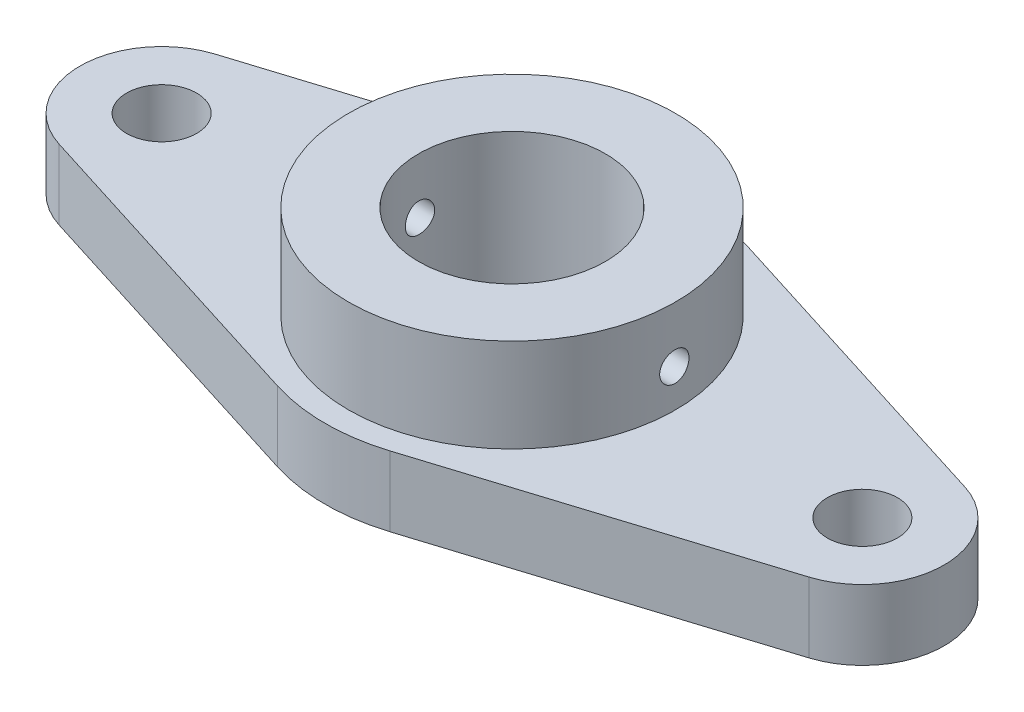
ISO-10303-21;
HEADER;
FILE_DESCRIPTION(('STEP AP214'),'2;1');
FILE_NAME('part.step','',(''),(''),'','','');
FILE_SCHEMA(('AUTOMOTIVE_DESIGN { 1 0 10303 214 1 1 1 1 }'));
ENDSEC;
DATA;
#1=APPLICATION_CONTEXT('core data for automotive mechanical design processes');
#2=APPLICATION_PROTOCOL_DEFINITION('international standard','automotive_design',2000,#1);
#3=PRODUCT_CONTEXT('',#1,'mechanical');
#4=PRODUCT('Part','Part','',(#3));
#5=PRODUCT_RELATED_PRODUCT_CATEGORY('part','',(#4));
#6=PRODUCT_DEFINITION_FORMATION('','',#4);
#7=PRODUCT_DEFINITION_CONTEXT('part definition',#1,'design');
#8=PRODUCT_DEFINITION('design','',#6,#7);
#9=PRODUCT_DEFINITION_SHAPE('','',#8);
#10=(LENGTH_UNIT() NAMED_UNIT(*) SI_UNIT(.MILLI.,.METRE.));
#11=(NAMED_UNIT(*) PLANE_ANGLE_UNIT() SI_UNIT($,.RADIAN.));
#12=(NAMED_UNIT(*) SI_UNIT($,.STERADIAN.) SOLID_ANGLE_UNIT());
#13=UNCERTAINTY_MEASURE_WITH_UNIT(LENGTH_MEASURE(1.E-05),#10,'distance_accuracy_value','');
#14=(GEOMETRIC_REPRESENTATION_CONTEXT(3) GLOBAL_UNCERTAINTY_ASSIGNED_CONTEXT((#13)) GLOBAL_UNIT_ASSIGNED_CONTEXT((#10,
#11,#12)) REPRESENTATION_CONTEXT('',''));
#15=CARTESIAN_POINT('',(0.,0.,0.));
#16=DIRECTION('',(0.,0.,1.));
#17=DIRECTION('',(1.,0.,0.));
#18=AXIS2_PLACEMENT_3D('',#15,#16,#17);
#19=CARTESIAN_POINT('',(2.4,3.,-7.63151361133556));
#20=DIRECTION('',(0.3,0.,-0.953939201416946));
#21=DIRECTION('',(-0.953939201416946,0.,-0.3));
#22=AXIS2_PLACEMENT_3D('',#19,#20,#21);
#23=PLANE('',#22);
#24=DIRECTION('',(0.953939201416946,0.,0.3));
#25=VECTOR('',#24,1.);
#26=CARTESIAN_POINT('',(2.4,0.,-7.63151361133556));
#27=LINE('',#26,#25);
#28=CARTESIAN_POINT('',(2.4,0.,-7.63151361133556));
#29=VERTEX_POINT('',#28);
#30=CARTESIAN_POINT('',(16.05,0.,-3.33878720495931));
#31=VERTEX_POINT('',#30);
#32=EDGE_CURVE('E226',#29,#31,#27,.T.);
#33=ORIENTED_EDGE('',*,*,#32,.F.);
#34=DIRECTION('',(0.,-1.,0.));
#35=VECTOR('',#34,1.);
#36=CARTESIAN_POINT('',(2.4,3.,-7.63151361133556));
#37=LINE('',#36,#35);
#38=CARTESIAN_POINT('',(2.4,3.,-7.63151361133556));
#39=VERTEX_POINT('',#38);
#40=EDGE_CURVE('E52',#39,#29,#37,.T.);
#41=ORIENTED_EDGE('',*,*,#40,.F.);
#42=DIRECTION('',(0.953939201416946,0.,0.3));
#43=VECTOR('',#42,1.);
#44=CARTESIAN_POINT('',(2.4,3.,-7.63151361133556));
#45=LINE('',#44,#43);
#46=CARTESIAN_POINT('',(16.05,3.,-3.33878720495931));
#47=VERTEX_POINT('',#46);
#48=EDGE_CURVE('E260',#39,#47,#45,.T.);
#49=ORIENTED_EDGE('',*,*,#48,.T.);
#50=DIRECTION('',(0.,-1.,0.));
#51=VECTOR('',#50,1.);
#52=CARTESIAN_POINT('',(16.05,3.,-3.33878720495931));
#53=LINE('',#52,#51);
#54=EDGE_CURVE('E95',#47,#31,#53,.T.);
#55=ORIENTED_EDGE('',*,*,#54,.T.);
#56=EDGE_LOOP('',(#33,#41,#49,#55));
#57=FACE_BOUND('',#56,.T.);
#58=ADVANCED_FACE('F38',(#57),#23,.T.);
#59=CARTESIAN_POINT('',(0.,3.,0.));
#60=DIRECTION('',(0.,-1.,0.));
#61=DIRECTION('',(0.,0.,-1.));
#62=AXIS2_PLACEMENT_3D('',#59,#60,#61);
#63=CYLINDRICAL_SURFACE('',#62,8.);
#64=CARTESIAN_POINT('',(0.,0.,0.));
#65=DIRECTION('',(0.,1.,0.));
#66=DIRECTION('',(0.,0.,1.));
#67=AXIS2_PLACEMENT_3D('',#64,#65,#66);
#68=CIRCLE('',#67,8.);
#69=CARTESIAN_POINT('',(-2.4,0.,-7.63151361133557));
#70=VERTEX_POINT('',#69);
#71=EDGE_CURVE('E229',#29,#70,#68,.T.);
#72=ORIENTED_EDGE('',*,*,#71,.T.);
#73=DIRECTION('',(0.,-1.,0.));
#74=VECTOR('',#73,1.);
#75=CARTESIAN_POINT('',(-2.4,3.,-7.63151361133557));
#76=LINE('',#75,#74);
#77=CARTESIAN_POINT('',(-2.4,3.,-7.63151361133557));
#78=VERTEX_POINT('',#77);
#79=EDGE_CURVE('E146',#78,#70,#76,.T.);
#80=ORIENTED_EDGE('',*,*,#79,.F.);
#81=CARTESIAN_POINT('',(0.,3.,0.));
#82=DIRECTION('',(0.,1.,0.));
#83=DIRECTION('',(0.,0.,1.));
#84=AXIS2_PLACEMENT_3D('',#81,#82,#83);
#85=CIRCLE('',#84,8.);
#86=EDGE_CURVE('E258',#39,#78,#85,.T.);
#87=ORIENTED_EDGE('',*,*,#86,.F.);
#88=ORIENTED_EDGE('',*,*,#40,.T.);
#89=EDGE_LOOP('',(#72,#80,#87,#88));
#90=FACE_BOUND('',#89,.T.);
#91=ADVANCED_FACE('F206',(#90),#63,.T.);
#92=CARTESIAN_POINT('',(-2.4,3.,-7.63151361133556));
#93=DIRECTION('',(-0.3,0.,-0.953939201416946));
#94=DIRECTION('',(-0.953939201416946,0.,0.3));
#95=AXIS2_PLACEMENT_3D('',#92,#93,#94);
#96=PLANE('',#95);
#97=DIRECTION('',(0.953939201416946,0.,-0.3));
#98=VECTOR('',#97,1.);
#99=CARTESIAN_POINT('',(-2.4,0.,-7.63151361133556));
#100=LINE('',#99,#98);
#101=CARTESIAN_POINT('',(-16.05,0.,-3.33878720495931));
#102=VERTEX_POINT('',#101);
#103=EDGE_CURVE('E238',#102,#70,#100,.T.);
#104=ORIENTED_EDGE('',*,*,#103,.F.);
#105=DIRECTION('',(0.,-1.,0.));
#106=VECTOR('',#105,1.);
#107=CARTESIAN_POINT('',(-16.05,3.,-3.33878720495931));
#108=LINE('',#107,#106);
#109=CARTESIAN_POINT('',(-16.05,3.,-3.33878720495931));
#110=VERTEX_POINT('',#109);
#111=EDGE_CURVE('E144',#110,#102,#108,.T.);
#112=ORIENTED_EDGE('',*,*,#111,.F.);
#113=DIRECTION('',(0.953939201416946,0.,-0.3));
#114=VECTOR('',#113,1.);
#115=CARTESIAN_POINT('',(-2.4,3.,-7.63151361133556));
#116=LINE('',#115,#114);
#117=EDGE_CURVE('E255',#110,#78,#116,.T.);
#118=ORIENTED_EDGE('',*,*,#117,.T.);
#119=ORIENTED_EDGE('',*,*,#79,.T.);
#120=EDGE_LOOP('',(#104,#112,#118,#119));
#121=FACE_BOUND('',#120,.T.);
#122=ADVANCED_FACE('F202',(#121),#96,.T.);
#123=CARTESIAN_POINT('',(-15.,3.,0.));
#124=DIRECTION('',(0.,-1.,0.));
#125=DIRECTION('',(0.,0.,-1.));
#126=AXIS2_PLACEMENT_3D('',#123,#124,#125);
#127=CYLINDRICAL_SURFACE('',#126,3.5);
#128=CARTESIAN_POINT('',(-15.,0.,0.));
#129=DIRECTION('',(0.,1.,0.));
#130=DIRECTION('',(0.,0.,1.));
#131=AXIS2_PLACEMENT_3D('',#128,#129,#130);
#132=CIRCLE('',#131,3.5);
#133=CARTESIAN_POINT('',(-16.05,0.,3.33878720495931));
#134=VERTEX_POINT('',#133);
#135=EDGE_CURVE('E241',#102,#134,#132,.T.);
#136=ORIENTED_EDGE('',*,*,#135,.T.);
#137=DIRECTION('',(0.,-1.,0.));
#138=VECTOR('',#137,1.);
#139=CARTESIAN_POINT('',(-16.05,3.,3.33878720495931));
#140=LINE('',#139,#138);
#141=CARTESIAN_POINT('',(-16.05,3.,3.33878720495931));
#142=VERTEX_POINT('',#141);
#143=EDGE_CURVE('E137',#142,#134,#140,.T.);
#144=ORIENTED_EDGE('',*,*,#143,.F.);
#145=CARTESIAN_POINT('',(-15.,3.,0.));
#146=DIRECTION('',(0.,1.,0.));
#147=DIRECTION('',(0.,0.,1.));
#148=AXIS2_PLACEMENT_3D('',#145,#146,#147);
#149=CIRCLE('',#148,3.5);
#150=EDGE_CURVE('E253',#110,#142,#149,.T.);
#151=ORIENTED_EDGE('',*,*,#150,.F.);
#152=ORIENTED_EDGE('',*,*,#111,.T.);
#153=EDGE_LOOP('',(#136,#144,#151,#152));
#154=FACE_BOUND('',#153,.T.);
#155=ADVANCED_FACE('F198',(#154),#127,.T.);
#156=CARTESIAN_POINT('',(-2.4,3.,7.63151361133556));
#157=DIRECTION('',(0.3,0.,-0.953939201416946));
#158=DIRECTION('',(-0.953939201416946,0.,-0.3));
#159=AXIS2_PLACEMENT_3D('',#156,#157,#158);
#160=PLANE('',#159);
#161=DIRECTION('',(0.953939201416946,0.,0.3));
#162=VECTOR('',#161,1.);
#163=CARTESIAN_POINT('',(-2.4,0.,7.63151361133556));
#164=LINE('',#163,#162);
#165=CARTESIAN_POINT('',(-2.4,0.,7.63151361133556));
#166=VERTEX_POINT('',#165);
#167=EDGE_CURVE('E244',#134,#166,#164,.T.);
#168=ORIENTED_EDGE('',*,*,#167,.T.);
#169=DIRECTION('',(0.,-1.,0.));
#170=VECTOR('',#169,1.);
#171=CARTESIAN_POINT('',(-2.4,3.,7.63151361133556));
#172=LINE('',#171,#170);
#173=CARTESIAN_POINT('',(-2.4,3.,7.63151361133556));
#174=VERTEX_POINT('',#173);
#175=EDGE_CURVE('E135',#174,#166,#172,.T.);
#176=ORIENTED_EDGE('',*,*,#175,.F.);
#177=DIRECTION('',(0.953939201416946,0.,0.3));
#178=VECTOR('',#177,1.);
#179=CARTESIAN_POINT('',(-2.4,3.,7.63151361133556));
#180=LINE('',#179,#178);
#181=EDGE_CURVE('E128',#142,#174,#180,.T.);
#182=ORIENTED_EDGE('',*,*,#181,.F.);
#183=ORIENTED_EDGE('',*,*,#143,.T.);
#184=EDGE_LOOP('',(#168,#176,#182,#183));
#185=FACE_BOUND('',#184,.T.);
#186=ADVANCED_FACE('F195',(#185),#160,.F.);
#187=CARTESIAN_POINT('',(0.,3.,0.));
#188=DIRECTION('',(0.,-1.,0.));
#189=DIRECTION('',(0.,0.,-1.));
#190=AXIS2_PLACEMENT_3D('',#187,#188,#189);
#191=CYLINDRICAL_SURFACE('',#190,8.);
#192=CARTESIAN_POINT('',(0.,0.,0.));
#193=DIRECTION('',(0.,1.,0.));
#194=DIRECTION('',(0.,0.,1.));
#195=AXIS2_PLACEMENT_3D('',#192,#193,#194);
#196=CIRCLE('',#195,8.);
#197=CARTESIAN_POINT('',(2.4,0.,7.63151361133556));
#198=VERTEX_POINT('',#197);
#199=EDGE_CURVE('E134',#166,#198,#196,.T.);
#200=ORIENTED_EDGE('',*,*,#199,.T.);
#201=DIRECTION('',(0.,-1.,0.));
#202=VECTOR('',#201,1.);
#203=CARTESIAN_POINT('',(2.4,3.,7.63151361133556));
#204=LINE('',#203,#202);
#205=CARTESIAN_POINT('',(2.4,3.,7.63151361133556));
#206=VERTEX_POINT('',#205);
#207=EDGE_CURVE('E120',#206,#198,#204,.T.);
#208=ORIENTED_EDGE('',*,*,#207,.F.);
#209=CARTESIAN_POINT('',(0.,3.,0.));
#210=DIRECTION('',(0.,1.,0.));
#211=DIRECTION('',(0.,0.,1.));
#212=AXIS2_PLACEMENT_3D('',#209,#210,#211);
#213=CIRCLE('',#212,8.);
#214=EDGE_CURVE('E123',#174,#206,#213,.T.);
#215=ORIENTED_EDGE('',*,*,#214,.F.);
#216=ORIENTED_EDGE('',*,*,#175,.T.);
#217=EDGE_LOOP('',(#200,#208,#215,#216));
#218=FACE_BOUND('',#217,.T.);
#219=ADVANCED_FACE('F133',(#218),#191,.T.);
#220=CARTESIAN_POINT('',(2.4,3.,7.63151361133556));
#221=DIRECTION('',(-0.3,0.,-0.953939201416946));
#222=DIRECTION('',(-0.953939201416946,0.,0.3));
#223=AXIS2_PLACEMENT_3D('',#220,#221,#222);
#224=PLANE('',#223);
#225=DIRECTION('',(0.953939201416946,0.,-0.3));
#226=VECTOR('',#225,1.);
#227=CARTESIAN_POINT('',(2.4,0.,7.63151361133556));
#228=LINE('',#227,#226);
#229=CARTESIAN_POINT('',(16.05,0.,3.33878720495931));
#230=VERTEX_POINT('',#229);
#231=EDGE_CURVE('E248',#198,#230,#228,.T.);
#232=ORIENTED_EDGE('',*,*,#231,.T.);
#233=DIRECTION('',(0.,-1.,0.));
#234=VECTOR('',#233,1.);
#235=CARTESIAN_POINT('',(16.05,3.,3.33878720495931));
#236=LINE('',#235,#234);
#237=CARTESIAN_POINT('',(16.05,3.,3.33878720495931));
#238=VERTEX_POINT('',#237);
#239=EDGE_CURVE('E122',#238,#230,#236,.T.);
#240=ORIENTED_EDGE('',*,*,#239,.F.);
#241=DIRECTION('',(0.953939201416946,0.,-0.3));
#242=VECTOR('',#241,1.);
#243=CARTESIAN_POINT('',(2.4,3.,7.63151361133556));
#244=LINE('',#243,#242);
#245=EDGE_CURVE('E115',#206,#238,#244,.T.);
#246=ORIENTED_EDGE('',*,*,#245,.F.);
#247=ORIENTED_EDGE('',*,*,#207,.T.);
#248=EDGE_LOOP('',(#232,#240,#246,#247));
#249=FACE_BOUND('',#248,.T.);
#250=ADVANCED_FACE('F118',(#249),#224,.F.);
#251=CARTESIAN_POINT('',(-15.,3.,0.));
#252=DIRECTION('',(0.,-1.,0.));
#253=DIRECTION('',(0.,0.,-1.));
#254=AXIS2_PLACEMENT_3D('',#251,#252,#253);
#255=CYLINDRICAL_SURFACE('',#254,1.5);
#256=CARTESIAN_POINT('',(-15.,3.,0.));
#257=DIRECTION('',(0.,1.,0.));
#258=DIRECTION('',(0.,0.,1.));
#259=AXIS2_PLACEMENT_3D('',#256,#257,#258);
#260=CIRCLE('',#259,1.5);
#261=CARTESIAN_POINT('',(-15.,3.,1.5));
#262=VERTEX_POINT('',#261);
#263=EDGE_CURVE('E221',#262,#262,#260,.T.);
#264=ORIENTED_EDGE('',*,*,#263,.T.);
#265=EDGE_LOOP('',(#264));
#266=FACE_BOUND('',#265,.T.);
#267=CARTESIAN_POINT('',(-15.,0.,0.));
#268=DIRECTION('',(0.,1.,0.));
#269=DIRECTION('',(0.,0.,1.));
#270=AXIS2_PLACEMENT_3D('',#267,#268,#269);
#271=CIRCLE('',#270,1.5);
#272=CARTESIAN_POINT('',(-15.,0.,1.5));
#273=VERTEX_POINT('',#272);
#274=EDGE_CURVE('E224',#273,#273,#271,.T.);
#275=ORIENTED_EDGE('',*,*,#274,.F.);
#276=EDGE_LOOP('',(#275));
#277=FACE_BOUND('',#276,.T.);
#278=ADVANCED_FACE('F192',(#266,#277),#255,.F.);
#279=CARTESIAN_POINT('',(15.,3.,0.));
#280=DIRECTION('',(0.,-1.,0.));
#281=DIRECTION('',(0.,0.,-1.));
#282=AXIS2_PLACEMENT_3D('',#279,#280,#281);
#283=CYLINDRICAL_SURFACE('',#282,1.5);
#284=CARTESIAN_POINT('',(15.,3.,0.));
#285=DIRECTION('',(0.,1.,0.));
#286=DIRECTION('',(0.,0.,1.));
#287=AXIS2_PLACEMENT_3D('',#284,#285,#286);
#288=CIRCLE('',#287,1.5);
#289=CARTESIAN_POINT('',(15.,3.,1.5));
#290=VERTEX_POINT('',#289);
#291=EDGE_CURVE('E263',#290,#290,#288,.T.);
#292=ORIENTED_EDGE('',*,*,#291,.T.);
#293=EDGE_LOOP('',(#292));
#294=FACE_BOUND('',#293,.T.);
#295=CARTESIAN_POINT('',(15.,0.,0.));
#296=DIRECTION('',(0.,1.,0.));
#297=DIRECTION('',(0.,0.,1.));
#298=AXIS2_PLACEMENT_3D('',#295,#296,#297);
#299=CIRCLE('',#298,1.5);
#300=CARTESIAN_POINT('',(15.,0.,1.5));
#301=VERTEX_POINT('',#300);
#302=EDGE_CURVE('E227',#301,#301,#299,.T.);
#303=ORIENTED_EDGE('',*,*,#302,.F.);
#304=EDGE_LOOP('',(#303));
#305=FACE_BOUND('',#304,.T.);
#306=ADVANCED_FACE('F40',(#294,#305),#283,.F.);
#307=CARTESIAN_POINT('',(15.,3.,0.));
#308=DIRECTION('',(0.,-1.,0.));
#309=DIRECTION('',(0.,0.,-1.));
#310=AXIS2_PLACEMENT_3D('',#307,#308,#309);
#311=CYLINDRICAL_SURFACE('',#310,3.5);
#312=CARTESIAN_POINT('',(15.,0.,0.));
#313=DIRECTION('',(0.,1.,0.));
#314=DIRECTION('',(0.,0.,1.));
#315=AXIS2_PLACEMENT_3D('',#312,#313,#314);
#316=CIRCLE('',#315,3.5);
#317=EDGE_CURVE('E88',#230,#31,#316,.T.);
#318=ORIENTED_EDGE('',*,*,#317,.T.);
#319=ORIENTED_EDGE('',*,*,#54,.F.);
#320=CARTESIAN_POINT('',(15.,3.,0.));
#321=DIRECTION('',(0.,1.,0.));
#322=DIRECTION('',(0.,0.,1.));
#323=AXIS2_PLACEMENT_3D('',#320,#321,#322);
#324=CIRCLE('',#323,3.5);
#325=EDGE_CURVE('E60',#238,#47,#324,.T.);
#326=ORIENTED_EDGE('',*,*,#325,.F.);
#327=ORIENTED_EDGE('',*,*,#239,.T.);
#328=EDGE_LOOP('',(#318,#319,#326,#327));
#329=FACE_BOUND('',#328,.T.);
#330=ADVANCED_FACE('F182',(#329),#311,.T.);
#331=CARTESIAN_POINT('',(0.,3.,0.));
#332=DIRECTION('',(0.,1.,0.));
#333=DIRECTION('',(0.,0.,1.));
#334=AXIS2_PLACEMENT_3D('',#331,#332,#333);
#335=PLANE('',#334);
#336=CARTESIAN_POINT('',(0.,3.,0.));
#337=DIRECTION('',(0.,1.,0.));
#338=DIRECTION('',(0.,0.,1.));
#339=AXIS2_PLACEMENT_3D('',#336,#337,#338);
#340=CIRCLE('',#339,7.);
#341=CARTESIAN_POINT('',(0.,3.,7.));
#342=VERTEX_POINT('',#341);
#343=EDGE_CURVE('E250',#342,#342,#340,.T.);
#344=ORIENTED_EDGE('',*,*,#343,.F.);
#345=EDGE_LOOP('',(#344));
#346=FACE_BOUND('',#345,.T.);
#347=ORIENTED_EDGE('',*,*,#291,.F.);
#348=EDGE_LOOP('',(#347));
#349=FACE_BOUND('',#348,.T.);
#350=ORIENTED_EDGE('',*,*,#263,.F.);
#351=EDGE_LOOP('',(#350));
#352=FACE_BOUND('',#351,.T.);
#353=ORIENTED_EDGE('',*,*,#48,.F.);
#354=ORIENTED_EDGE('',*,*,#86,.T.);
#355=ORIENTED_EDGE('',*,*,#117,.F.);
#356=ORIENTED_EDGE('',*,*,#150,.T.);
#357=ORIENTED_EDGE('',*,*,#181,.T.);
#358=ORIENTED_EDGE('',*,*,#214,.T.);
#359=ORIENTED_EDGE('',*,*,#245,.T.);
#360=ORIENTED_EDGE('',*,*,#325,.T.);
#361=EDGE_LOOP('',(#353,#354,#355,#356,#357,#358,#359,#360));
#362=FACE_BOUND('',#361,.T.);
#363=ADVANCED_FACE('F126',(#346,#349,#352,#362),#335,.T.);
#364=CARTESIAN_POINT('',(0.,0.,0.));
#365=DIRECTION('',(0.,1.,0.));
#366=DIRECTION('',(0.,0.,1.));
#367=AXIS2_PLACEMENT_3D('',#364,#365,#366);
#368=PLANE('',#367);
#369=ORIENTED_EDGE('',*,*,#302,.T.);
#370=EDGE_LOOP('',(#369));
#371=FACE_BOUND('',#370,.T.);
#372=ORIENTED_EDGE('',*,*,#274,.T.);
#373=EDGE_LOOP('',(#372));
#374=FACE_BOUND('',#373,.T.);
#375=ORIENTED_EDGE('',*,*,#32,.T.);
#376=ORIENTED_EDGE('',*,*,#317,.F.);
#377=ORIENTED_EDGE('',*,*,#231,.F.);
#378=ORIENTED_EDGE('',*,*,#199,.F.);
#379=ORIENTED_EDGE('',*,*,#167,.F.);
#380=ORIENTED_EDGE('',*,*,#135,.F.);
#381=ORIENTED_EDGE('',*,*,#103,.T.);
#382=ORIENTED_EDGE('',*,*,#71,.F.);
#383=EDGE_LOOP('',(#375,#376,#377,#378,#379,#380,#381,#382));
#384=FACE_BOUND('',#383,.T.);
#385=CARTESIAN_POINT('',(0.,0.,0.));
#386=DIRECTION('',(0.,1.,0.));
#387=DIRECTION('',(0.,0.,1.));
#388=AXIS2_PLACEMENT_3D('',#385,#386,#387);
#389=CIRCLE('',#388,4.);
#390=CARTESIAN_POINT('',(0.,0.,4.));
#391=VERTEX_POINT('',#390);
#392=EDGE_CURVE('E268',#391,#391,#389,.T.);
#393=ORIENTED_EDGE('',*,*,#392,.T.);
#394=EDGE_LOOP('',(#393));
#395=FACE_BOUND('',#394,.T.);
#396=ADVANCED_FACE('F177',(#371,#374,#384,#395),#368,.F.);
#397=CARTESIAN_POINT('',(0.,7.,0.));
#398=DIRECTION('',(0.,-1.,0.));
#399=DIRECTION('',(0.,0.,-1.));
#400=AXIS2_PLACEMENT_3D('',#397,#398,#399);
#401=CYLINDRICAL_SURFACE('',#400,4.);
#402=CARTESIAN_POINT('',(-3.94878159589708,4.61929095844161,-0.638062620676469));
#403=CARTESIAN_POINT('',(-3.94878220203193,4.65416680302341,-0.63806119562125));
#404=CARTESIAN_POINT('',(-3.94925807383533,4.68906245785273,-0.635135124798576));
#405=CARTESIAN_POINT('',(-3.95110950022572,4.7578768656829,-0.623511848899801));
#406=CARTESIAN_POINT('',(-3.95248591495991,4.79179465230958,-0.61480912617991));
#407=CARTESIAN_POINT('',(-3.95598126660865,4.85764735585604,-0.591899968592106));
#408=CARTESIAN_POINT('',(-3.95809961517018,4.88958382041019,-0.577697893767246));
#409=CARTESIAN_POINT('',(-3.96284339564535,4.95061518115125,-0.544203091130718));
#410=CARTESIAN_POINT('',(-3.96546876238102,4.97971044185626,-0.524911017529712));
#411=CARTESIAN_POINT('',(-3.9709615835842,5.03449007972967,-0.481604442439208));
#412=CARTESIAN_POINT('',(-3.97383075904678,5.06014622704159,-0.457554445920992));
#413=CARTESIAN_POINT('',(-3.97948007935308,5.10707451354903,-0.405490575164493));
#414=CARTESIAN_POINT('',(-3.98226021915805,5.12834640499767,-0.377476477072308));
#415=CARTESIAN_POINT('',(-3.98744348456528,5.16600717770191,-0.318097303754582));
#416=CARTESIAN_POINT('',(-3.98984456396647,5.18236995943523,-0.286715481445986));
#417=CARTESIAN_POINT('',(-3.99398975263066,5.20958044712287,-0.221604895418708));
#418=CARTESIAN_POINT('',(-3.99573389950037,5.22042846878728,-0.187876266176197));
#419=CARTESIAN_POINT('',(-3.998365829791,5.23621563818065,-0.119320096734012));
#420=CARTESIAN_POINT('',(-3.99926046199476,5.2412021207087,-0.0845037236807146));
#421=CARTESIAN_POINT('',(-4.00012669182014,5.24527171926745,-0.0145173015368005));
#422=CARTESIAN_POINT('',(-4.00009834490619,5.24435519002957,0.020652726174731));
#423=CARTESIAN_POINT('',(-3.99913602812696,5.23668197687214,0.0900248547301468));
#424=CARTESIAN_POINT('',(-3.99820994738236,5.22997622373153,0.124232717680179));
#425=CARTESIAN_POINT('',(-3.99557555994173,5.21099495128595,0.19103425344088));
#426=CARTESIAN_POINT('',(-3.99386723174018,5.19871927885308,0.223627881845776));
#427=CARTESIAN_POINT('',(-3.98985637077956,5.1688950444766,0.286428452070859));
#428=CARTESIAN_POINT('',(-3.98755144587204,5.15132520708462,0.316625130869637));
#429=CARTESIAN_POINT('',(-3.98261189527037,5.1114269382843,0.373661994965611));
#430=CARTESIAN_POINT('',(-3.97997724606473,5.08909816745286,0.400501940632563));
#431=CARTESIAN_POINT('',(-3.97464584090126,5.04003258667329,0.450363291350779));
#432=CARTESIAN_POINT('',(-3.97194872222649,5.0132512918429,0.473340904458272));
#433=CARTESIAN_POINT('',(-3.96682988618911,4.95619156727108,0.5144820591802));
#434=CARTESIAN_POINT('',(-3.96440817080785,4.9259131123731,0.53264556616162));
#435=CARTESIAN_POINT('',(-3.96011944870581,4.86267105141516,0.563649106808541));
#436=CARTESIAN_POINT('',(-3.95825294075579,4.82970506467325,0.576484357903326));
#437=CARTESIAN_POINT('',(-3.95529829575294,4.76204974626524,0.596420936429727));
#438=CARTESIAN_POINT('',(-3.95421009891977,4.72736054717418,0.603522704242846));
#439=CARTESIAN_POINT('',(-3.95294877871486,4.65763393262281,0.611729730579045));
#440=CARTESIAN_POINT('',(-3.95276615836851,4.62260400839292,0.612897226346213));
#441=CARTESIAN_POINT('',(-3.95331175188346,4.55284904961714,0.60936791675242));
#442=CARTESIAN_POINT('',(-3.95403993498634,4.51812400481515,0.60467130942588));
#443=CARTESIAN_POINT('',(-3.95631502214541,4.45015900657499,0.589600210255034));
#444=CARTESIAN_POINT('',(-3.95785741859531,4.41691195878171,0.57925696835301));
#445=CARTESIAN_POINT('',(-3.96158054275174,4.35262246566564,0.55321924676081));
#446=CARTESIAN_POINT('',(-3.96376130442976,4.32158013777936,0.537524482274599));
#447=CARTESIAN_POINT('',(-3.96853332331791,4.26230313802941,0.501081285217316));
#448=CARTESIAN_POINT('',(-3.97112778016775,4.23409340121662,0.480292721137289));
#449=CARTESIAN_POINT('',(-3.97641932085834,4.18153921322956,0.434308327113715));
#450=CARTESIAN_POINT('',(-3.97911641100515,4.15719500003986,0.409112226016591));
#451=CARTESIAN_POINT('',(-3.98433185347809,4.11283814078275,0.354754106223823));
#452=CARTESIAN_POINT('',(-3.98684836136301,4.0928668143341,0.325558167629805));
#453=CARTESIAN_POINT('',(-3.99138426454935,4.05811107844406,0.264191073397203));
#454=CARTESIAN_POINT('',(-3.99340367437693,4.04332651743013,0.232020004735387));
#455=CARTESIAN_POINT('',(-3.99670173466229,4.01942938962058,0.165743212838397));
#456=CARTESIAN_POINT('',(-3.99798328809801,4.01029458408177,0.131645659070386));
#457=CARTESIAN_POINT('',(-3.99966349537798,3.99788442527342,0.0623799241617243));
#458=CARTESIAN_POINT('',(-4.00006221271928,3.99460865060263,0.0272118202037004));
#459=CARTESIAN_POINT('',(-3.99992261548401,3.99402049527782,-0.0427965366862649));
#460=CARTESIAN_POINT('',(-3.9993942277861,3.99664502228093,-0.0776362956812588));
#461=CARTESIAN_POINT('',(-3.9974689922802,4.0076472874867,-0.146369596202406));
#462=CARTESIAN_POINT('',(-3.99607214796722,4.0160250025362,-0.180263141535934));
#463=CARTESIAN_POINT('',(-3.99255697831352,4.03827277336973,-0.246122460783383));
#464=CARTESIAN_POINT('',(-3.99043927490124,4.05213809633694,-0.278089868602));
#465=CARTESIAN_POINT('',(-3.98570567460008,4.08496066807204,-0.339252617450155));
#466=CARTESIAN_POINT('',(-3.98308975879544,4.10391811018484,-0.368447853164885));
#467=CARTESIAN_POINT('',(-3.97760919851123,4.14661331924405,-0.423557332214368));
#468=CARTESIAN_POINT('',(-3.97474230411666,4.17039753701888,-0.449435368281587));
#469=CARTESIAN_POINT('',(-3.96909386079756,4.22197344777422,-0.496855805606047));
#470=CARTESIAN_POINT('',(-3.966312332037,4.24976607886812,-0.518397189094691));
#471=CARTESIAN_POINT('',(-3.96112523063814,4.30877123451446,-0.556653376336843));
#472=CARTESIAN_POINT('',(-3.95872206972352,4.34000369811016,-0.573337751527328));
#473=CARTESIAN_POINT('',(-3.95458696166577,4.40485176286539,-0.60120053220772));
#474=CARTESIAN_POINT('',(-3.95285432775459,4.43846488372508,-0.612384574453292));
#475=CARTESIAN_POINT('',(-3.95064765777821,4.49673339336339,-0.626430995769273));
#476=CARTESIAN_POINT('',(-3.94995160441191,4.52103135843694,-0.630786073442075));
#477=CARTESIAN_POINT('',(-3.9490183625539,4.56997990370411,-0.636602368405989));
#478=CARTESIAN_POINT('',(-3.94878116730312,4.59463047869833,-0.638063628323617));
#479=CARTESIAN_POINT('',(-3.94878159589708,4.61929095844161,-0.638062620676469));
#480=B_SPLINE_CURVE_WITH_KNOTS('',3,(#402,#403,#404,#405,#406,#407,#408,#409,#410,#411,#412,
#413,#414,#415,#416,#417,#418,#419,#420,#421,#422,#423,#424,#425,#426,#427,#428,#429,#430,#431,
#432,#433,#434,#435,#436,#437,#438,#439,#440,#441,#442,#443,#444,#445,#446,#447,#448,#449,#450,
#451,#452,#453,#454,#455,#456,#457,#458,#459,#460,#461,#462,#463,#464,#465,#466,#467,#468,#469,
#470,#471,#472,#473,#474,#475,#476,#477,#478,#479),.UNSPECIFIED.,.T.,.F.,(4,2,2,2,2,2,2,2,2,2,2,
2,2,2,2,2,2,2,2,2,2,2,2,2,2,2,2,2,2,2,2,2,2,2,2,2,2,2,4),(0.,0.104537381970646,
0.209174758133979,0.313729344103092,0.418270498353515,0.523623145118171,0.628981743551662,
0.734890945046195,0.840794082746889,0.945835993784247,1.05087159256627,1.15499244786742,
1.25911616582689,1.36366403231754,1.46821935800936,1.57389010847867,1.67956161913009,
1.78532777508708,1.89108580650808,1.99573235007659,2.10037535976161,2.20444503362055,
2.30852024669884,2.4134433820829,2.51837297465506,2.62425492998865,2.73013379088242,
2.83559319057104,2.94104500495907,3.04537458517295,3.149703745525,3.25394312202838,
3.35818645700218,3.46348510099497,3.56880842878142,3.67477805414637,3.78063885408468,
3.85455763643563,3.92847532993999),.UNSPECIFIED.);
#481=CARTESIAN_POINT('',(-3.94878159589708,4.61929095844161,-0.638062620676469));
#482=VERTEX_POINT('',#481);
#483=EDGE_CURVE('E169',#482,#482,#480,.T.);
#484=ORIENTED_EDGE('',*,*,#483,.F.);
#485=EDGE_LOOP('',(#484));
#486=FACE_BOUND('',#485,.T.);
#487=CARTESIAN_POINT('',(3.95291550754522,4.61929095844161,-0.611930543614627));
#488=CARTESIAN_POINT('',(3.95291610424119,4.58441511385982,-0.61192911458147));
#489=CARTESIAN_POINT('',(3.95337261195189,4.5495194590305,-0.608999960242306));
#490=CARTESIAN_POINT('',(3.95514711891121,4.48070505120033,-0.597364692847467));
#491=CARTESIAN_POINT('',(3.95646594179328,4.44678726457365,-0.58865305657949));
#492=CARTESIAN_POINT('',(3.95980969071917,4.38093456102719,-0.565721281077976));
#493=CARTESIAN_POINT('',(3.96183405726112,4.34899809647304,-0.551505505683617));
#494=CARTESIAN_POINT('',(3.96635619189373,4.28796673573198,-0.517980059299996));
#495=CARTESIAN_POINT('',(3.96885389913494,4.25887147502697,-0.498671042938187));
#496=CARTESIAN_POINT('',(3.9740601608651,4.20409183715356,-0.455329084403337));
#497=CARTESIAN_POINT('',(3.97677020153945,4.17843568984164,-0.431260636594957));
#498=CARTESIAN_POINT('',(3.98207503624769,4.1315074033342,-0.379160538833141));
#499=CARTESIAN_POINT('',(3.98466982376231,4.11023551188556,-0.351128665064025));
#500=CARTESIAN_POINT('',(3.98946022872751,4.07257473918131,-0.29171650734822));
#501=CARTESIAN_POINT('',(3.99165368925284,4.056211957448,-0.260319490218834));
#502=CARTESIAN_POINT('',(3.99536813134339,4.02900146976035,-0.19518291123411));
#503=CARTESIAN_POINT('',(3.99688915140398,4.01815344809595,-0.161443483603262));
#504=CARTESIAN_POINT('',(3.99906757836707,4.00236627870258,-0.0928714056005738));
#505=CARTESIAN_POINT('',(3.99973190776461,3.99737979617453,-0.0580498768314644));
#506=CARTESIAN_POINT('',(4.0001352128762,3.99331019761578,0.0119407438516205));
#507=CARTESIAN_POINT('',(3.99987424419488,3.99422672685366,0.0471098147538322));
#508=CARTESIAN_POINT('',(3.99845310577433,4.00189994001108,0.116474060871572));
#509=CARTESIAN_POINT('',(3.99730078687135,4.0086056931517,0.150675050247605));
#510=CARTESIAN_POINT('',(3.99422461683723,4.02758696559727,0.21745770035298));
#511=CARTESIAN_POINT('',(3.99230074449476,4.03986263803015,0.250039316535276));
#512=CARTESIAN_POINT('',(3.98787459432605,4.06968687240663,0.312811984320906));
#513=CARTESIAN_POINT('',(3.98536999228561,4.08725670979861,0.342992757305124));
#514=CARTESIAN_POINT('',(3.98005329522478,4.12715497859893,0.399995702478268));
#515=CARTESIAN_POINT('',(3.97724117827837,4.14948374943036,0.426817634886681));
#516=CARTESIAN_POINT('',(3.97158009566905,4.19854933020993,0.476642631827497));
#517=CARTESIAN_POINT('',(3.96873105694677,4.22533062504033,0.499601902974953));
#518=CARTESIAN_POINT('',(3.96334021613001,4.28239034961215,0.540708300646357));
#519=CARTESIAN_POINT('',(3.96079841624591,4.31266880451013,0.558855392551153));
#520=CARTESIAN_POINT('',(3.9563047236412,4.37591086546807,0.589829888458077));
#521=CARTESIAN_POINT('',(3.9543533613134,4.40887685220998,0.602652513293084));
#522=CARTESIAN_POINT('',(3.95126691597548,4.47653217061798,0.622569113043248));
#523=CARTESIAN_POINT('',(3.95013177027353,4.51122136970904,0.629663527934875));
#524=CARTESIAN_POINT('',(3.94881619456103,4.58094798426042,0.637862032096431));
#525=CARTESIAN_POINT('',(3.94862585613262,4.6159779084903,0.639028294433955));
#526=CARTESIAN_POINT('',(3.94919478135194,4.68573286726609,0.635502670717901));
#527=CARTESIAN_POINT('',(3.9499540129321,4.72045791206808,0.630810982490968));
#528=CARTESIAN_POINT('',(3.95232873392817,4.78842291030823,0.615755260921092));
#529=CARTESIAN_POINT('',(3.95393950914233,4.82166995810151,0.60542244702255));
#530=CARTESIAN_POINT('',(3.95783477114149,4.88595945121758,0.579409920556346));
#531=CARTESIAN_POINT('',(3.96011929378095,4.91700177910387,0.563729923423573));
#532=CARTESIAN_POINT('',(3.9651322516977,4.97627877885382,0.527319086726928));
#533=CARTESIAN_POINT('',(3.96786415198342,5.0044885156666,0.506548137695073));
#534=CARTESIAN_POINT('',(3.97345972793781,5.05704270365366,0.460599748971048));
#535=CARTESIAN_POINT('',(3.97632341170585,5.08138691684337,0.43542203817294));
#536=CARTESIAN_POINT('',(3.98189827679229,5.12574377610048,0.381099603517804));
#537=CARTESIAN_POINT('',(3.98460783806357,5.14571510254913,0.351920948304829));
#538=CARTESIAN_POINT('',(3.989549537644,5.18047083843917,0.290585197901612));
#539=CARTESIAN_POINT('',(3.9917816899037,5.1952553994531,0.258428189782316));
#540=CARTESIAN_POINT('',(3.99551804749257,5.21915252726265,0.192174661742137));
#541=CARTESIAN_POINT('',(3.99702510170151,5.22828733280146,0.158086330310658));
#542=CARTESIAN_POINT('',(3.99916341120827,5.24069749160981,0.0888332237998743));
#543=CARTESIAN_POINT('',(3.99979472949124,5.2439732662806,0.0536685263214909));
#544=CARTESIAN_POINT('',(4.00011818615654,5.24456142160541,-0.0163392225182379));
#545=CARTESIAN_POINT('',(3.99982024793337,5.24193689460229,-0.0511817142948567));
#546=CARTESIAN_POINT('',(3.99834967188097,5.23093462939653,-0.119926245265383));
#547=CARTESIAN_POINT('',(3.99717703757187,5.22255691434703,-0.153828288243465));
#548=CARTESIAN_POINT('',(3.99409755299872,5.2003091435135,-0.21970941698452));
#549=CARTESIAN_POINT('',(3.99219133545652,5.18644382054629,-0.251690132502875));
#550=CARTESIAN_POINT('',(3.98786238272666,5.15362124881119,-0.312882852549759));
#551=CARTESIAN_POINT('',(3.9854396279271,5.13466380669839,-0.342094751890897));
#552=CARTESIAN_POINT('',(3.98032369388025,5.09196859763918,-0.397239275109097));
#553=CARTESIAN_POINT('',(3.97762802528427,5.06818437986435,-0.423135707392069));
#554=CARTESIAN_POINT('',(3.97229335484232,5.01660846910901,-0.470592467492691));
#555=CARTESIAN_POINT('',(3.96965436642813,4.98881583801511,-0.492151777430637));
#556=CARTESIAN_POINT('',(3.96472041342615,4.92981068236877,-0.530441436491575));
#557=CARTESIAN_POINT('',(3.96242765924799,4.89857821877307,-0.547141341765468));
#558=CARTESIAN_POINT('',(3.95847693227242,4.83373015401784,-0.575030863494199));
#559=CARTESIAN_POINT('',(3.95681831000473,4.80011703315815,-0.586226121123838));
#560=CARTESIAN_POINT('',(3.95470459445294,4.74184852351984,-0.600286830591603));
#561=CARTESIAN_POINT('',(3.95403736176485,4.71755055844629,-0.604646416852341));
#562=CARTESIAN_POINT('',(3.95314261058959,4.66860201317912,-0.61046875725867));
#563=CARTESIAN_POINT('',(3.95291508562544,4.6439514381849,-0.611931554074549));
#564=CARTESIAN_POINT('',(3.95291550754522,4.61929095844161,-0.611930543614627));
#565=B_SPLINE_CURVE_WITH_KNOTS('',3,(#487,#488,#489,#490,#491,#492,#493,#494,#495,#496,#497,
#498,#499,#500,#501,#502,#503,#504,#505,#506,#507,#508,#509,#510,#511,#512,#513,#514,#515,#516,
#517,#518,#519,#520,#521,#522,#523,#524,#525,#526,#527,#528,#529,#530,#531,#532,#533,#534,#535,
#536,#537,#538,#539,#540,#541,#542,#543,#544,#545,#546,#547,#548,#549,#550,#551,#552,#553,#554,
#555,#556,#557,#558,#559,#560,#561,#562,#563,#564),.UNSPECIFIED.,.T.,.F.,(4,2,2,2,2,2,2,2,2,2,2,
2,2,2,2,2,2,2,2,2,2,2,2,2,2,2,2,2,2,2,2,2,2,2,2,2,2,2,4),(0.,0.104537381970645,
0.209174758133978,0.313729344103091,0.418270498353514,0.52362314511817,0.62898174355166,
0.734890945046194,0.840794082746888,0.945835993784246,1.05087159256627,1.15499244786742,
1.25911616582689,1.36366403231753,1.46821935800936,1.57389010847867,1.67956161913009,
1.78532777508707,1.89108580650807,1.99573235007659,2.1003753597616,2.20444503362055,
2.30852024669884,2.4134433820829,2.51837297465506,2.62425492998865,2.73013379088241,
2.83559319057104,2.94104500495907,3.04537458517294,3.149703745525,3.25394312202838,
3.35818645700218,3.46348510099496,3.56880842878142,3.67477805414636,3.78063885408468,
3.85455763643563,3.92847532993999),.UNSPECIFIED.);
#566=CARTESIAN_POINT('',(3.95291550754522,4.61929095844161,-0.611930543614627));
#567=VERTEX_POINT('',#566);
#568=EDGE_CURVE('E165',#567,#567,#565,.T.);
#569=ORIENTED_EDGE('',*,*,#568,.F.);
#570=EDGE_LOOP('',(#569));
#571=FACE_BOUND('',#570,.T.);
#572=CARTESIAN_POINT('',(0.,7.,0.));
#573=DIRECTION('',(0.,1.,0.));
#574=DIRECTION('',(0.,0.,1.));
#575=AXIS2_PLACEMENT_3D('',#572,#573,#574);
#576=CIRCLE('',#575,4.);
#577=CARTESIAN_POINT('',(0.,7.,4.));
#578=VERTEX_POINT('',#577);
#579=EDGE_CURVE('E271',#578,#578,#576,.T.);
#580=ORIENTED_EDGE('',*,*,#579,.T.);
#581=EDGE_LOOP('',(#580));
#582=FACE_BOUND('',#581,.T.);
#583=ORIENTED_EDGE('',*,*,#392,.F.);
#584=EDGE_LOOP('',(#583));
#585=FACE_BOUND('',#584,.T.);
#586=ADVANCED_FACE('F173',(#486,#571,#582,#585),#401,.F.);
#587=CARTESIAN_POINT('',(0.,7.,0.));
#588=DIRECTION('',(0.,-1.,0.));
#589=DIRECTION('',(0.,0.,-1.));
#590=AXIS2_PLACEMENT_3D('',#587,#588,#589);
#591=CYLINDRICAL_SURFACE('',#590,7.);
#592=CARTESIAN_POINT('',(-6.96993730078638,4.61929095844161,-0.64805402792259));
#593=CARTESIAN_POINT('',(-6.96993767492216,4.65432233097226,-0.648052502979157));
#594=CARTESIAN_POINT('',(-6.97021394124593,4.68937732177613,-0.645099741460934));
#595=CARTESIAN_POINT('',(-6.9712899046748,4.75851671025019,-0.633364385175938));
#596=CARTESIAN_POINT('',(-6.97209018939256,4.79259997343775,-0.62457524557829));
#597=CARTESIAN_POINT('',(-6.97412530169766,4.85878457067269,-0.601423725453943));
#598=CARTESIAN_POINT('',(-6.97535987714835,4.89088704202646,-0.587064578216633));
#599=CARTESIAN_POINT('',(-6.97812814925383,4.95221807328684,-0.553186226557878));
#600=CARTESIAN_POINT('',(-6.97966178347259,4.98144723115719,-0.533668098901241));
#601=CARTESIAN_POINT('',(-6.98286584011682,5.03629487665311,-0.489963844907435));
#602=CARTESIAN_POINT('',(-6.98453660757899,5.0619037861113,-0.465765722411389));
#603=CARTESIAN_POINT('',(-6.98783055255336,5.10870163562394,-0.413413408029267));
#604=CARTESIAN_POINT('',(-6.98945372795097,5.12989037953818,-0.385259040681724));
#605=CARTESIAN_POINT('',(-6.99248058280002,5.16727877911226,-0.325735282624476));
#606=CARTESIAN_POINT('',(-6.99388389244637,5.18347007269811,-0.294360619108983));
#607=CARTESIAN_POINT('',(-6.99631822327393,5.21035047189819,-0.229323218323147));
#608=CARTESIAN_POINT('',(-6.99734925183022,5.22103968651342,-0.19566052639561));
#609=CARTESIAN_POINT('',(-6.99892978086017,5.23658472391121,-0.127098285800753));
#610=CARTESIAN_POINT('',(-6.99948056729476,5.24145613824729,-0.0922023022378896));
#611=CARTESIAN_POINT('',(-7.00005294981914,5.24527550733826,-0.0220837564944811));
#612=CARTESIAN_POINT('',(-7.00007455705644,5.2442235868726,0.0131387987909835));
#613=CARTESIAN_POINT('',(-6.99959668272704,5.2362388653817,0.0828048586913158));
#614=CARTESIAN_POINT('',(-6.99909868581614,5.22932283033913,0.117250297203692));
#615=CARTESIAN_POINT('',(-6.99764922855994,5.2098322868921,0.184491018448717));
#616=CARTESIAN_POINT('',(-6.99669776336274,5.19725771794399,0.217286283521111));
#617=CARTESIAN_POINT('',(-6.99445513807235,5.16678846844508,0.28034861666333));
#618=CARTESIAN_POINT('',(-6.99316350075791,5.14888630929323,0.310612053662698));
#619=CARTESIAN_POINT('',(-6.99039387846681,5.10827548584113,0.367711632006631));
#620=CARTESIAN_POINT('',(-6.98891588914298,5.08556670940508,0.394547693368938));
#621=CARTESIAN_POINT('',(-6.98594090443183,5.03589284367216,0.444128416109382));
#622=CARTESIAN_POINT('',(-6.98444386072354,5.00891318027103,0.466858475637283));
#623=CARTESIAN_POINT('',(-6.98161094017719,4.95151409666299,0.507468625183098));
#624=CARTESIAN_POINT('',(-6.98027506350234,4.92109467297294,0.525348710289828));
#625=CARTESIAN_POINT('',(-6.97792053371598,4.85766898605323,0.555750577545701));
#626=CARTESIAN_POINT('',(-6.97690192835334,4.82466233438421,0.568271553262695));
#627=CARTESIAN_POINT('',(-6.97530175901196,4.75700423999368,0.587588415851675));
#628=CARTESIAN_POINT('',(-6.97472018446382,4.72235283707128,0.594384441179434));
#629=CARTESIAN_POINT('',(-6.97406360500017,4.65251677952497,0.602039728141005));
#630=CARTESIAN_POINT('',(-6.97398686023607,4.61733437568324,0.60291938023692));
#631=CARTESIAN_POINT('',(-6.9743442838526,4.54732267139258,0.598770387154242));
#632=CARTESIAN_POINT('',(-6.97477844675096,4.51249336715879,0.593741805373573));
#633=CARTESIAN_POINT('',(-6.97610577529378,4.44423536048001,0.577936233016947));
#634=CARTESIAN_POINT('',(-6.97699817766916,4.41080442865408,0.567168800260746));
#635=CARTESIAN_POINT('',(-6.97913781220368,4.34622300877202,0.540201162176752));
#636=CARTESIAN_POINT('',(-6.98038505088102,4.31507256262061,0.524000857048528));
#637=CARTESIAN_POINT('',(-6.9830935214986,4.25584320296351,0.486576282044355));
#638=CARTESIAN_POINT('',(-6.9845553269028,4.22777288434217,0.46533845183706));
#639=CARTESIAN_POINT('',(-6.98752030165804,4.17558755793217,0.418461656001536));
#640=CARTESIAN_POINT('',(-6.98902347182497,4.15147262822739,0.392822603508596));
#641=CARTESIAN_POINT('',(-6.99189977707258,4.10781279313786,0.337783382160812));
#642=CARTESIAN_POINT('',(-6.99327252810494,4.08828115026808,0.308372670072966));
#643=CARTESIAN_POINT('',(-6.9957202509968,4.05443340800669,0.246677802120499));
#644=CARTESIAN_POINT('',(-6.99679522620797,4.04011724991023,0.214393678603731));
#645=CARTESIAN_POINT('',(-6.99851583870619,4.01712953481431,0.147915859322327));
#646=CARTESIAN_POINT('',(-6.99916209493087,4.00844984088768,0.113724994006919));
#647=CARTESIAN_POINT('',(-6.9999452805527,3.99695485715636,0.0443657703159709));
#648=CARTESIAN_POINT('',(-7.00008222116024,3.99413943827557,0.00919743347241338));
#649=CARTESIAN_POINT('',(-6.99982198469292,3.99445453138704,-0.060987791069662));
#650=CARTESIAN_POINT('',(-6.9994266632413,3.99756440172953,-0.096004780161749));
#651=CARTESIAN_POINT('',(-6.99813985847357,4.00959866985705,-0.165015276961212));
#652=CARTESIAN_POINT('',(-6.99724837456989,4.01852307452787,-0.199008783456491));
#653=CARTESIAN_POINT('',(-6.99505979999626,4.0419276684732,-0.265008401376146));
#654=CARTESIAN_POINT('',(-6.99376274235509,4.0564074053589,-0.297014674380915));
#655=CARTESIAN_POINT('',(-6.9908990851292,4.09050934277645,-0.358144521130702));
#656=CARTESIAN_POINT('',(-6.98933248889733,4.11013147934245,-0.387268130726703));
#657=CARTESIAN_POINT('',(-6.98609094809407,4.15403873300967,-0.441912051311674));
#658=CARTESIAN_POINT('',(-6.98441565987799,4.17833917027148,-0.467420031969488));
#659=CARTESIAN_POINT('',(-6.98114204919256,4.23088446234983,-0.514006417383475));
#660=CARTESIAN_POINT('',(-6.97954374540058,4.25913026794366,-0.535083751341168));
#661=CARTESIAN_POINT('',(-6.9765955909544,4.31882720323788,-0.572244036894268));
#662=CARTESIAN_POINT('',(-6.97524626787628,4.35028492474707,-0.588316431718405));
#663=CARTESIAN_POINT('',(-6.97295055698438,4.4154438795466,-0.614931398644204));
#664=CARTESIAN_POINT('',(-6.97200370909565,4.44914249997656,-0.625480287957843));
#665=CARTESIAN_POINT('',(-6.97085902946629,4.50574624159227,-0.638081193201005));
#666=CARTESIAN_POINT('',(-6.97051494459264,4.52828801376759,-0.641815991849336));
#667=CARTESIAN_POINT('',(-6.97005395871608,4.57364683453663,-0.646802902114103));
#668=CARTESIAN_POINT('',(-6.96993705699274,4.59646388225721,-0.648055021603323));
#669=CARTESIAN_POINT('',(-6.96993730078638,4.61929095844161,-0.64805402792259));
#670=B_SPLINE_CURVE_WITH_KNOTS('',3,(#592,#593,#594,#595,#596,#597,#598,#599,#600,#601,#602,
#603,#604,#605,#606,#607,#608,#609,#610,#611,#612,#613,#614,#615,#616,#617,#618,#619,#620,#621,
#622,#623,#624,#625,#626,#627,#628,#629,#630,#631,#632,#633,#634,#635,#636,#637,#638,#639,#640,
#641,#642,#643,#644,#645,#646,#647,#648,#649,#650,#651,#652,#653,#654,#655,#656,#657,#658,#659,
#660,#661,#662,#663,#664,#665,#666,#667,#668,#669),.UNSPECIFIED.,.T.,.F.,(4,2,2,2,2,2,2,2,2,2,2,
2,2,2,2,2,2,2,2,2,2,2,2,2,2,2,2,2,2,2,2,2,2,2,2,2,2,2,4),(0.,0.105010766871597,
0.210139490624297,0.3152072801427,0.42025315756291,0.525571954246592,0.630895423347425,
0.736394183210109,0.841890852969417,0.947104155359957,1.05231524136243,1.15722653065799,
1.2621389424817,1.36719932533871,1.47226215946831,1.57769156462962,1.68312107655052,
1.78856644780095,1.89400926882152,1.9990884997791,2.10416660320104,2.20907024772863,
2.31397581941401,2.41916705314137,2.52436036321393,2.6298544143212,2.73534727796376,
2.84068750915928,2.94602542173063,3.0509970444261,3.15596879143311,3.26093199206231,
3.36589388712573,3.47120553742886,3.57654261025854,3.6821003856286,3.78753716981803,
3.85596430252228,3.92439121823801),.UNSPECIFIED.);
#671=CARTESIAN_POINT('',(-6.96993730078638,4.61929095844161,-0.64805402792259));
#672=VERTEX_POINT('',#671);
#673=EDGE_CURVE('E42',#672,#672,#670,.T.);
#674=ORIENTED_EDGE('',*,*,#673,.T.);
#675=EDGE_LOOP('',(#674));
#676=FACE_BOUND('',#675,.T.);
#677=CARTESIAN_POINT('',(6.97407121243452,4.61929095844161,-0.601939136368505));
#678=CARTESIAN_POINT('',(6.9740715764758,4.58425958591097,-0.601937608983812));
#679=CARTESIAN_POINT('',(6.9743283065349,4.5492045951071,-0.598983084767985));
#680=CARTESIAN_POINT('',(6.97532662617072,4.48006520663304,-0.587240868523137));
#681=CARTESIAN_POINT('',(6.9760687600583,4.44598194344548,-0.578446627919803));
#682=CARTESIAN_POINT('',(6.97795069854238,4.37979734621054,-0.555282153531107));
#683=CARTESIAN_POINT('',(6.97909027239347,4.34769487485677,-0.540915154632097));
#684=CARTESIAN_POINT('',(6.98163440499051,4.28636384359639,-0.507019234067922));
#685=CARTESIAN_POINT('',(6.98303890842378,4.25713468572604,-0.487491389556977));
#686=CARTESIAN_POINT('',(6.98595382532316,4.20228704023012,-0.443766899215702));
#687=CARTESIAN_POINT('',(6.98746450447315,4.17667813077192,-0.419558255206753));
#688=CARTESIAN_POINT('',(6.99041210754113,4.12988028125929,-0.367185299105226));
#689=CARTESIAN_POINT('',(6.99184902818402,4.10869153734505,-0.339020811569007));
#690=CARTESIAN_POINT('',(6.99448211344518,4.07130313777097,-0.279478335255518));
#691=CARTESIAN_POINT('',(6.99567787339094,4.05511184418512,-0.248095076233771));
#692=CARTESIAN_POINT('',(6.997681979132,4.02823144498504,-0.18304299688396));
#693=CARTESIAN_POINT('',(6.99849033260213,4.0175422303698,-0.149374221848929));
#694=CARTESIAN_POINT('',(6.99961734114716,4.00199719297202,-0.0808030270282102));
#695=CARTESIAN_POINT('',(6.99993730573525,3.99712577863594,-0.0459041637633629));
#696=CARTESIAN_POINT('',(7.00004589607865,3.99330640954497,0.0242166340576976));
#697=CARTESIAN_POINT('',(6.99983453302681,3.99435833001063,0.059438561792713));
#698=CARTESIAN_POINT('',(6.99889588233198,4.00234305150152,0.129099937035989));
#699=CARTESIAN_POINT('',(6.99817006652109,4.0092590865441,0.1635413282193));
#700=CARTESIAN_POINT('',(6.9962758958815,4.02874962999113,0.230770991594009));
#701=CARTESIAN_POINT('',(6.99510753631781,4.04132419893924,0.263559246093449));
#702=CARTESIAN_POINT('',(6.99244785178241,4.07179344843814,0.326605366574455));
#703=CARTESIAN_POINT('',(6.99095607361661,4.08969560759,0.356859598408543));
#704=CARTESIAN_POINT('',(6.98780884259489,4.1303064310421,0.413939608846404));
#705=CARTESIAN_POINT('',(6.98615338592093,4.15301520747814,0.440765307440914));
#706=CARTESIAN_POINT('',(6.98285052835496,4.20268907321107,0.490325268431569));
#707=CARTESIAN_POINT('',(6.98120317572292,4.2296687366122,0.513044928977276));
#708=CARTESIAN_POINT('',(6.97810171258097,4.28706782022024,0.553635452641483));
#709=CARTESIAN_POINT('',(6.97664760226675,4.31748724391028,0.571506310849985));
#710=CARTESIAN_POINT('',(6.97409203927044,4.38091293083,0.60189193970526));
#711=CARTESIAN_POINT('',(6.9729906396701,4.41391958249902,0.614405904253344));
#712=CARTESIAN_POINT('',(6.97126273930463,4.48157767688954,0.633711760425234));
#713=CARTESIAN_POINT('',(6.97063622705457,4.51622907981195,0.640503790431875));
#714=CARTESIAN_POINT('',(6.96992902818207,4.58606513735826,0.648154567177461));
#715=CARTESIAN_POINT('',(6.96984646688205,4.62124754119999,0.64903369242474));
#716=CARTESIAN_POINT('',(6.97023132504348,4.69125924549065,0.644887154177316));
#717=CARTESIAN_POINT('',(6.97069873860346,4.72608854972444,0.639861554042891));
#718=CARTESIAN_POINT('',(6.97213057968379,4.79434655640322,0.624065106666921));
#719=CARTESIAN_POINT('',(6.97309418073421,4.82777748822915,0.613303811987632));
#720=CARTESIAN_POINT('',(6.97541213842361,4.89235890811121,0.586350915818189));
#721=CARTESIAN_POINT('',(6.97676650224073,4.92350935426262,0.5701592145729));
#722=CARTESIAN_POINT('',(6.97972244807745,4.98273871391972,0.532753372628898));
#723=CARTESIAN_POINT('',(6.98132469323952,5.01080903254106,0.511525675688479));
#724=CARTESIAN_POINT('',(6.98459965669445,5.06299435895106,0.464669516248406));
#725=CARTESIAN_POINT('',(6.98627237637775,5.08710928865584,0.43904096689134));
#726=CARTESIAN_POINT('',(6.98951266036283,5.13076912374537,0.384021974005757));
#727=CARTESIAN_POINT('',(6.99107991036,5.15030076661515,0.354620984934684));
#728=CARTESIAN_POINT('',(6.99393564329153,5.18414850887654,0.292943656292375));
#729=CARTESIAN_POINT('',(6.99522412936355,5.198464666973,0.260667349090454));
#730=CARTESIAN_POINT('',(6.99738440331055,5.22145238206892,0.194202364472582));
#731=CARTESIAN_POINT('',(6.9982567913884,5.23013207599555,0.160016521537736));
#732=CARTESIAN_POINT('',(6.99949871721427,5.24162705972687,0.0906639951888552));
#733=CARTESIAN_POINT('',(6.99986826603,5.24444247860766,0.0554973333804789));
#734=CARTESIAN_POINT('',(7.00007225594413,5.24412738549619,-0.0146880771772389));
#735=CARTESIAN_POINT('',(6.99990855329581,5.2410175151537,-0.0497069150444268));
#736=CARTESIAN_POINT('',(6.99907822745428,5.22898324702618,-0.118724413506888));
#737=CARTESIAN_POINT('',(6.99841160366548,5.22005884235535,-0.152723072893977));
#738=CARTESIAN_POINT('',(6.99665961312081,5.19665424841002,-0.218735722843333));
#739=CARTESIAN_POINT('',(6.99557428046173,5.18217451152433,-0.250749874763998));
#740=CARTESIAN_POINT('',(6.99311501228182,5.14807257410678,-0.311897325212723));
#741=CARTESIAN_POINT('',(6.9917410803509,5.12845043754077,-0.341030659568803));
#742=CARTESIAN_POINT('',(6.98886103750097,5.08454318387356,-0.39569482513326));
#743=CARTESIAN_POINT('',(6.98735450138924,5.06024274661175,-0.421213328553139));
#744=CARTESIAN_POINT('',(6.98438909502849,5.0076974545334,-0.467820347316154));
#745=CARTESIAN_POINT('',(6.98293023637394,4.97945164893957,-0.488907791760695));
#746=CARTESIAN_POINT('',(6.98022793281187,4.91975471364534,-0.526086764211328));
#747=CARTESIAN_POINT('',(6.97898494564406,4.88829699213616,-0.542167732187564));
#748=CARTESIAN_POINT('',(6.9768653222812,4.82313803733663,-0.568797301274581));
#749=CARTESIAN_POINT('',(6.97598826780472,4.78943941690667,-0.579352222502192));
#750=CARTESIAN_POINT('',(6.97492695840488,4.73283567529096,-0.591960423276245));
#751=CARTESIAN_POINT('',(6.97460758384695,4.71029390311564,-0.595697416082713));
#752=CARTESIAN_POINT('',(6.97417959258799,4.6649350823466,-0.600687266325906));
#753=CARTESIAN_POINT('',(6.97407097521864,4.64211803462602,-0.601940131640007));
#754=CARTESIAN_POINT('',(6.97407121243452,4.61929095844161,-0.601939136368505));
#755=B_SPLINE_CURVE_WITH_KNOTS('',3,(#677,#678,#679,#680,#681,#682,#683,#684,#685,#686,#687,
#688,#689,#690,#691,#692,#693,#694,#695,#696,#697,#698,#699,#700,#701,#702,#703,#704,#705,#706,
#707,#708,#709,#710,#711,#712,#713,#714,#715,#716,#717,#718,#719,#720,#721,#722,#723,#724,#725,
#726,#727,#728,#729,#730,#731,#732,#733,#734,#735,#736,#737,#738,#739,#740,#741,#742,#743,#744,
#745,#746,#747,#748,#749,#750,#751,#752,#753,#754),.UNSPECIFIED.,.T.,.F.,(4,2,2,2,2,2,2,2,2,2,2,
2,2,2,2,2,2,2,2,2,2,2,2,2,2,2,2,2,2,2,2,2,2,2,2,2,2,2,4),(0.,0.105010766871595,
0.210139490624296,0.3152072801427,0.420253157562908,0.525571954246591,0.630895423347424,
0.736394183210108,0.841890852969415,0.947104155359956,1.05231524136243,1.15722653065799,
1.2621389424817,1.36719932533871,1.47226215946831,1.57769156462962,1.68312107655052,
1.78856644780095,1.89400926882152,1.9990884997791,2.10416660320103,2.20907024772863,
2.31397581941401,2.41916705314137,2.52436036321393,2.6298544143212,2.73534727796376,
2.84068750915928,2.94602542173063,3.0509970444261,3.15596879143311,3.26093199206231,
3.36589388712573,3.47120553742886,3.57654261025854,3.6821003856286,3.78753716981803,
3.85596430252228,3.92439121823801),.UNSPECIFIED.);
#756=CARTESIAN_POINT('',(6.97407121243452,4.61929095844161,-0.601939136368505));
#757=VERTEX_POINT('',#756);
#758=EDGE_CURVE('E11',#757,#757,#755,.T.);
#759=ORIENTED_EDGE('',*,*,#758,.T.);
#760=EDGE_LOOP('',(#759));
#761=FACE_BOUND('',#760,.T.);
#762=ORIENTED_EDGE('',*,*,#343,.T.);
#763=EDGE_LOOP('',(#762));
#764=FACE_BOUND('',#763,.T.);
#765=CARTESIAN_POINT('',(0.,7.,0.));
#766=DIRECTION('',(0.,1.,0.));
#767=DIRECTION('',(0.,0.,1.));
#768=AXIS2_PLACEMENT_3D('',#765,#766,#767);
#769=CIRCLE('',#768,7.);
#770=CARTESIAN_POINT('',(0.,7.,7.));
#771=VERTEX_POINT('',#770);
#772=EDGE_CURVE('E232',#771,#771,#769,.T.);
#773=ORIENTED_EDGE('',*,*,#772,.F.);
#774=EDGE_LOOP('',(#773));
#775=FACE_BOUND('',#774,.T.);
#776=ADVANCED_FACE('F150',(#676,#761,#764,#775),#591,.T.);
#777=CARTESIAN_POINT('',(0.,7.,0.));
#778=DIRECTION('',(0.,1.,0.));
#779=DIRECTION('',(0.,0.,1.));
#780=AXIS2_PLACEMENT_3D('',#777,#778,#779);
#781=PLANE('',#780);
#782=ORIENTED_EDGE('',*,*,#579,.F.);
#783=EDGE_LOOP('',(#782));
#784=FACE_BOUND('',#783,.T.);
#785=ORIENTED_EDGE('',*,*,#772,.T.);
#786=EDGE_LOOP('',(#785));
#787=FACE_BOUND('',#786,.T.);
#788=ADVANCED_FACE('F159',(#784,#787),#781,.T.);
#789=CARTESIAN_POINT('',(6.99996172003018,4.61929095844161,0.0231499052296094));
#790=DIRECTION('',(0.999994531432883,0.,0.00330712931851569));
#791=DIRECTION('',(0.00330712931851569,0.,-0.999994531432883));
#792=AXIS2_PLACEMENT_3D('',#789,#790,#791);
#793=CYLINDRICAL_SURFACE('',#792,0.624999999999995);
#794=ORIENTED_EDGE('',*,*,#568,.T.);
#795=EDGE_LOOP('',(#794));
#796=FACE_BOUND('',#795,.T.);
#797=ORIENTED_EDGE('',*,*,#758,.F.);
#798=EDGE_LOOP('',(#797));
#799=FACE_BOUND('',#798,.T.);
#800=ADVANCED_FACE('F157',(#796,#799),#793,.F.);
#801=ORIENTED_EDGE('',*,*,#483,.T.);
#802=EDGE_LOOP('',(#801));
#803=FACE_BOUND('',#802,.T.);
#804=ORIENTED_EDGE('',*,*,#673,.F.);
#805=EDGE_LOOP('',(#804));
#806=FACE_BOUND('',#805,.T.);
#807=ADVANCED_FACE('F154',(#803,#806),#793,.F.);
#808=CLOSED_SHELL('',(#58,#91,#122,#155,#186,#219,#250,#278,#306,#330,#363,#396,#586,#776,#788,
#800,#807));
#809=MANIFOLD_SOLID_BREP('B2',#808);
#810=ADVANCED_BREP_SHAPE_REPRESENTATION('',(#18,#809),#14);
#811=SHAPE_DEFINITION_REPRESENTATION(#9,#810);
ENDSEC;
END-ISO-10303-21;
